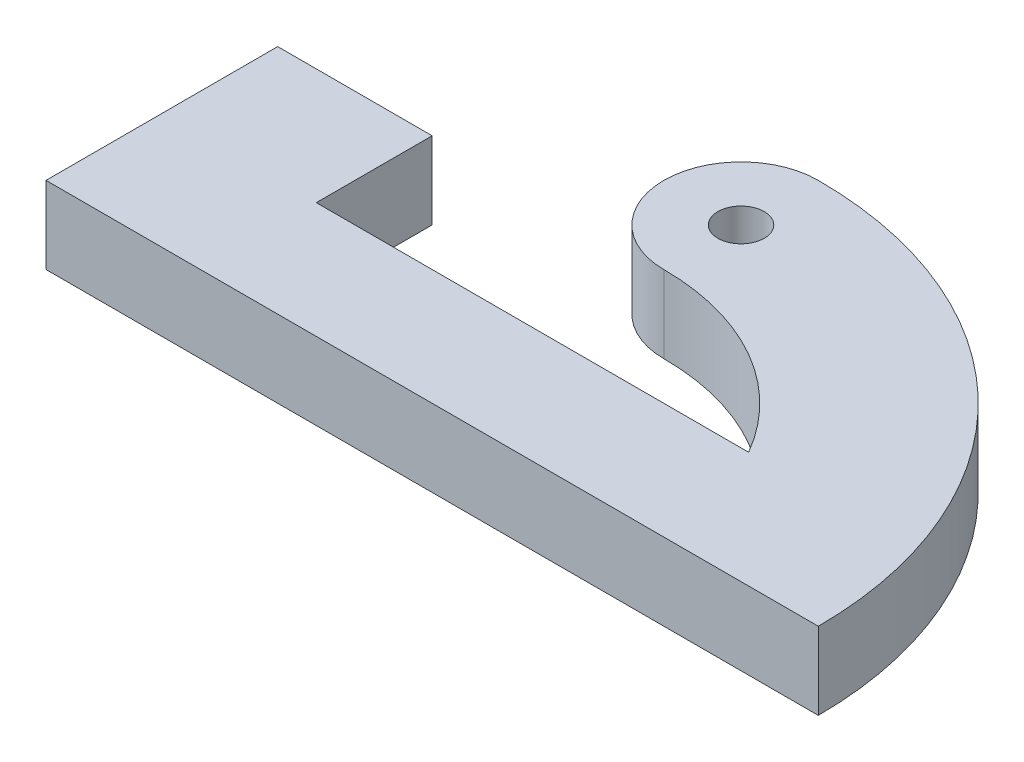
ISO-10303-21;
HEADER;
FILE_DESCRIPTION(('STEP AP214'),'2;1');
FILE_NAME('part.step','',(''),(''),'','','');
FILE_SCHEMA(('AUTOMOTIVE_DESIGN { 1 0 10303 214 1 1 1 1 }'));
ENDSEC;
DATA;
#1=APPLICATION_CONTEXT('core data for automotive mechanical design processes');
#2=APPLICATION_PROTOCOL_DEFINITION('international standard','automotive_design',2000,#1);
#3=PRODUCT_CONTEXT('',#1,'mechanical');
#4=PRODUCT('Part','Part','',(#3));
#5=PRODUCT_RELATED_PRODUCT_CATEGORY('part','',(#4));
#6=PRODUCT_DEFINITION_FORMATION('','',#4);
#7=PRODUCT_DEFINITION_CONTEXT('part definition',#1,'design');
#8=PRODUCT_DEFINITION('design','',#6,#7);
#9=PRODUCT_DEFINITION_SHAPE('','',#8);
#10=(LENGTH_UNIT() NAMED_UNIT(*) SI_UNIT(.MILLI.,.METRE.));
#11=(NAMED_UNIT(*) PLANE_ANGLE_UNIT() SI_UNIT($,.RADIAN.));
#12=(NAMED_UNIT(*) SI_UNIT($,.STERADIAN.) SOLID_ANGLE_UNIT());
#13=UNCERTAINTY_MEASURE_WITH_UNIT(LENGTH_MEASURE(1.E-05),#10,'distance_accuracy_value','');
#14=(GEOMETRIC_REPRESENTATION_CONTEXT(3) GLOBAL_UNCERTAINTY_ASSIGNED_CONTEXT((#13)) GLOBAL_UNIT_ASSIGNED_CONTEXT((#10,
#11,#12)) REPRESENTATION_CONTEXT('',''));
#15=CARTESIAN_POINT('',(0.,0.,0.));
#16=DIRECTION('',(0.,0.,1.));
#17=DIRECTION('',(1.,0.,0.));
#18=AXIS2_PLACEMENT_3D('',#15,#16,#17);
#19=CARTESIAN_POINT('',(0.,10.,0.));
#20=DIRECTION('',(0.,1.,0.));
#21=DIRECTION('',(0.,0.,1.));
#22=AXIS2_PLACEMENT_3D('',#19,#20,#21);
#23=PLANE('',#22);
#24=DIRECTION('',(1.,0.,0.));
#25=VECTOR('',#24,1.);
#26=CARTESIAN_POINT('',(0.,10.,0.));
#27=LINE('',#26,#25);
#28=CARTESIAN_POINT('',(-50.,10.,0.));
#29=VERTEX_POINT('',#28);
#30=CARTESIAN_POINT('',(50.,10.,0.));
#31=VERTEX_POINT('',#30);
#32=EDGE_CURVE('E63',#29,#31,#27,.T.);
#33=ORIENTED_EDGE('',*,*,#32,.T.);
#34=CARTESIAN_POINT('',(0.,10.,0.));
#35=DIRECTION('',(0.,1.,0.));
#36=DIRECTION('',(0.,0.,1.));
#37=AXIS2_PLACEMENT_3D('',#34,#35,#36);
#38=CIRCLE('',#37,50.);
#39=CARTESIAN_POINT('',(0.,10.,-50.));
#40=VERTEX_POINT('',#39);
#41=EDGE_CURVE('E107',#31,#40,#38,.T.);
#42=ORIENTED_EDGE('',*,*,#41,.T.);
#43=CARTESIAN_POINT('',(0.,10.,-40.));
#44=DIRECTION('',(0.,1.,0.));
#45=DIRECTION('',(0.,0.,1.));
#46=AXIS2_PLACEMENT_3D('',#43,#44,#45);
#47=CIRCLE('',#46,10.);
#48=CARTESIAN_POINT('',(0.,10.,-30.));
#49=VERTEX_POINT('',#48);
#50=EDGE_CURVE('E193',#40,#49,#47,.T.);
#51=ORIENTED_EDGE('',*,*,#50,.T.);
#52=CARTESIAN_POINT('',(0.,10.,0.));
#53=DIRECTION('',(0.,-1.,0.));
#54=DIRECTION('',(0.,0.,1.));
#55=AXIS2_PLACEMENT_3D('',#52,#53,#54);
#56=CIRCLE('',#55,30.);
#57=CARTESIAN_POINT('',(25.9807621135332,10.,-15.));
#58=VERTEX_POINT('',#57);
#59=EDGE_CURVE('E208',#49,#58,#56,.T.);
#60=ORIENTED_EDGE('',*,*,#59,.T.);
#61=DIRECTION('',(-1.,0.,0.));
#62=VECTOR('',#61,1.);
#63=CARTESIAN_POINT('',(-30.,10.,-15.));
#64=LINE('',#63,#62);
#65=CARTESIAN_POINT('',(-30.,10.,-15.));
#66=VERTEX_POINT('',#65);
#67=EDGE_CURVE('E127',#58,#66,#64,.T.);
#68=ORIENTED_EDGE('',*,*,#67,.T.);
#69=DIRECTION('',(0.,0.,-1.));
#70=VECTOR('',#69,1.);
#71=CARTESIAN_POINT('',(-30.,10.,-15.));
#72=LINE('',#71,#70);
#73=CARTESIAN_POINT('',(-30.,10.,-30.));
#74=VERTEX_POINT('',#73);
#75=EDGE_CURVE('E121',#66,#74,#72,.T.);
#76=ORIENTED_EDGE('',*,*,#75,.T.);
#77=DIRECTION('',(-1.,0.,0.));
#78=VECTOR('',#77,1.);
#79=CARTESIAN_POINT('',(-50.,10.,-30.));
#80=LINE('',#79,#78);
#81=CARTESIAN_POINT('',(-50.,10.,-30.));
#82=VERTEX_POINT('',#81);
#83=EDGE_CURVE('E125',#74,#82,#80,.T.);
#84=ORIENTED_EDGE('',*,*,#83,.T.);
#85=DIRECTION('',(0.,0.,1.));
#86=VECTOR('',#85,1.);
#87=CARTESIAN_POINT('',(-50.,10.,0.));
#88=LINE('',#87,#86);
#89=EDGE_CURVE('E144',#82,#29,#88,.T.);
#90=ORIENTED_EDGE('',*,*,#89,.T.);
#91=EDGE_LOOP('',(#33,#42,#51,#60,#68,#76,#84,#90));
#92=FACE_BOUND('',#91,.T.);
#93=CARTESIAN_POINT('',(0.,10.,-40.));
#94=DIRECTION('',(0.,1.,0.));
#95=DIRECTION('',(0.,0.,1.));
#96=AXIS2_PLACEMENT_3D('',#93,#94,#95);
#97=CIRCLE('',#96,3.);
#98=CARTESIAN_POINT('',(0.,10.,-37.));
#99=VERTEX_POINT('',#98);
#100=EDGE_CURVE('E155',#99,#99,#97,.T.);
#101=ORIENTED_EDGE('',*,*,#100,.F.);
#102=EDGE_LOOP('',(#101));
#103=FACE_BOUND('',#102,.T.);
#104=ADVANCED_FACE('F45',(#92,#103),#23,.T.);
#105=CARTESIAN_POINT('',(0.,0.,0.));
#106=DIRECTION('',(0.,1.,0.));
#107=DIRECTION('',(0.,0.,1.));
#108=AXIS2_PLACEMENT_3D('',#105,#106,#107);
#109=PLANE('',#108);
#110=CARTESIAN_POINT('',(0.,0.,0.));
#111=DIRECTION('',(0.,1.,0.));
#112=DIRECTION('',(0.,0.,1.));
#113=AXIS2_PLACEMENT_3D('',#110,#111,#112);
#114=CIRCLE('',#113,50.);
#115=CARTESIAN_POINT('',(50.,0.,0.));
#116=VERTEX_POINT('',#115);
#117=CARTESIAN_POINT('',(0.,0.,-50.));
#118=VERTEX_POINT('',#117);
#119=EDGE_CURVE('E151',#116,#118,#114,.T.);
#120=ORIENTED_EDGE('',*,*,#119,.F.);
#121=DIRECTION('',(1.,0.,0.));
#122=VECTOR('',#121,1.);
#123=CARTESIAN_POINT('',(-50.,0.,0.));
#124=LINE('',#123,#122);
#125=CARTESIAN_POINT('',(-50.,0.,0.));
#126=VERTEX_POINT('',#125);
#127=EDGE_CURVE('E170',#126,#116,#124,.T.);
#128=ORIENTED_EDGE('',*,*,#127,.F.);
#129=DIRECTION('',(0.,0.,1.));
#130=VECTOR('',#129,1.);
#131=CARTESIAN_POINT('',(-50.,0.,0.));
#132=LINE('',#131,#130);
#133=CARTESIAN_POINT('',(-50.,0.,-30.));
#134=VERTEX_POINT('',#133);
#135=EDGE_CURVE('E100',#134,#126,#132,.T.);
#136=ORIENTED_EDGE('',*,*,#135,.F.);
#137=DIRECTION('',(-1.,0.,0.));
#138=VECTOR('',#137,1.);
#139=CARTESIAN_POINT('',(-50.,0.,-30.));
#140=LINE('',#139,#138);
#141=CARTESIAN_POINT('',(-30.,0.,-30.));
#142=VERTEX_POINT('',#141);
#143=EDGE_CURVE('E93',#142,#134,#140,.T.);
#144=ORIENTED_EDGE('',*,*,#143,.F.);
#145=DIRECTION('',(0.,0.,-1.));
#146=VECTOR('',#145,1.);
#147=CARTESIAN_POINT('',(-30.,0.,-15.));
#148=LINE('',#147,#146);
#149=CARTESIAN_POINT('',(-30.,0.,-15.));
#150=VERTEX_POINT('',#149);
#151=EDGE_CURVE('E136',#150,#142,#148,.T.);
#152=ORIENTED_EDGE('',*,*,#151,.F.);
#153=DIRECTION('',(-1.,0.,0.));
#154=VECTOR('',#153,1.);
#155=CARTESIAN_POINT('',(-30.,0.,-15.));
#156=LINE('',#155,#154);
#157=CARTESIAN_POINT('',(25.9807621135332,0.,-15.));
#158=VERTEX_POINT('',#157);
#159=EDGE_CURVE('E161',#158,#150,#156,.T.);
#160=ORIENTED_EDGE('',*,*,#159,.F.);
#161=CARTESIAN_POINT('',(0.,0.,0.));
#162=DIRECTION('',(0.,-1.,0.));
#163=DIRECTION('',(0.,0.,1.));
#164=AXIS2_PLACEMENT_3D('',#161,#162,#163);
#165=CIRCLE('',#164,30.);
#166=CARTESIAN_POINT('',(0.,0.,-30.));
#167=VERTEX_POINT('',#166);
#168=EDGE_CURVE('E158',#167,#158,#165,.T.);
#169=ORIENTED_EDGE('',*,*,#168,.F.);
#170=CARTESIAN_POINT('',(0.,0.,-40.));
#171=DIRECTION('',(0.,1.,0.));
#172=DIRECTION('',(0.,0.,1.));
#173=AXIS2_PLACEMENT_3D('',#170,#171,#172);
#174=CIRCLE('',#173,10.);
#175=EDGE_CURVE('E154',#118,#167,#174,.T.);
#176=ORIENTED_EDGE('',*,*,#175,.F.);
#177=EDGE_LOOP('',(#120,#128,#136,#144,#152,#160,#169,#176));
#178=FACE_BOUND('',#177,.T.);
#179=CARTESIAN_POINT('',(0.,0.,-40.));
#180=DIRECTION('',(0.,1.,0.));
#181=DIRECTION('',(0.,0.,1.));
#182=AXIS2_PLACEMENT_3D('',#179,#180,#181);
#183=CIRCLE('',#182,3.);
#184=CARTESIAN_POINT('',(0.,0.,-37.));
#185=VERTEX_POINT('',#184);
#186=EDGE_CURVE('E218',#185,#185,#183,.T.);
#187=ORIENTED_EDGE('',*,*,#186,.T.);
#188=EDGE_LOOP('',(#187));
#189=FACE_BOUND('',#188,.T.);
#190=ADVANCED_FACE('F197',(#178,#189),#109,.F.);
#191=CARTESIAN_POINT('',(0.,10.,0.));
#192=DIRECTION('',(0.,-1.,0.));
#193=DIRECTION('',(0.,0.,-1.));
#194=AXIS2_PLACEMENT_3D('',#191,#192,#193);
#195=CYLINDRICAL_SURFACE('',#194,50.);
#196=ORIENTED_EDGE('',*,*,#119,.T.);
#197=DIRECTION('',(0.,-1.,0.));
#198=VECTOR('',#197,1.);
#199=CARTESIAN_POINT('',(0.,10.,-50.));
#200=LINE('',#199,#198);
#201=EDGE_CURVE('E55',#40,#118,#200,.T.);
#202=ORIENTED_EDGE('',*,*,#201,.F.);
#203=ORIENTED_EDGE('',*,*,#41,.F.);
#204=DIRECTION('',(0.,-1.,0.));
#205=VECTOR('',#204,1.);
#206=CARTESIAN_POINT('',(50.,10.,0.));
#207=LINE('',#206,#205);
#208=EDGE_CURVE('E11',#31,#116,#207,.T.);
#209=ORIENTED_EDGE('',*,*,#208,.T.);
#210=EDGE_LOOP('',(#196,#202,#203,#209));
#211=FACE_BOUND('',#210,.T.);
#212=ADVANCED_FACE('F47',(#211),#195,.T.);
#213=CARTESIAN_POINT('',(0.,10.,-40.));
#214=DIRECTION('',(0.,-1.,0.));
#215=DIRECTION('',(0.,0.,-1.));
#216=AXIS2_PLACEMENT_3D('',#213,#214,#215);
#217=CYLINDRICAL_SURFACE('',#216,10.);
#218=ORIENTED_EDGE('',*,*,#175,.T.);
#219=DIRECTION('',(0.,-1.,0.));
#220=VECTOR('',#219,1.);
#221=CARTESIAN_POINT('',(0.,10.,-30.));
#222=LINE('',#221,#220);
#223=EDGE_CURVE('E183',#49,#167,#222,.T.);
#224=ORIENTED_EDGE('',*,*,#223,.F.);
#225=ORIENTED_EDGE('',*,*,#50,.F.);
#226=ORIENTED_EDGE('',*,*,#201,.T.);
#227=EDGE_LOOP('',(#218,#224,#225,#226));
#228=FACE_BOUND('',#227,.T.);
#229=ADVANCED_FACE('F191',(#228),#217,.T.);
#230=CARTESIAN_POINT('',(0.,10.,0.));
#231=DIRECTION('',(0.,-1.,0.));
#232=DIRECTION('',(0.,0.,-1.));
#233=AXIS2_PLACEMENT_3D('',#230,#231,#232);
#234=CYLINDRICAL_SURFACE('',#233,30.);
#235=ORIENTED_EDGE('',*,*,#168,.T.);
#236=DIRECTION('',(0.,-1.,0.));
#237=VECTOR('',#236,1.);
#238=CARTESIAN_POINT('',(25.9807621135332,10.,-15.));
#239=LINE('',#238,#237);
#240=EDGE_CURVE('E179',#58,#158,#239,.T.);
#241=ORIENTED_EDGE('',*,*,#240,.F.);
#242=ORIENTED_EDGE('',*,*,#59,.F.);
#243=ORIENTED_EDGE('',*,*,#223,.T.);
#244=EDGE_LOOP('',(#235,#241,#242,#243));
#245=FACE_BOUND('',#244,.T.);
#246=ADVANCED_FACE('F203',(#245),#234,.F.);
#247=CARTESIAN_POINT('',(-30.,10.,-15.));
#248=DIRECTION('',(0.,0.,1.));
#249=DIRECTION('',(1.,0.,0.));
#250=AXIS2_PLACEMENT_3D('',#247,#248,#249);
#251=PLANE('',#250);
#252=ORIENTED_EDGE('',*,*,#159,.T.);
#253=DIRECTION('',(0.,-1.,0.));
#254=VECTOR('',#253,1.);
#255=CARTESIAN_POINT('',(-30.,10.,-15.));
#256=LINE('',#255,#254);
#257=EDGE_CURVE('E138',#66,#150,#256,.T.);
#258=ORIENTED_EDGE('',*,*,#257,.F.);
#259=ORIENTED_EDGE('',*,*,#67,.F.);
#260=ORIENTED_EDGE('',*,*,#240,.T.);
#261=EDGE_LOOP('',(#252,#258,#259,#260));
#262=FACE_BOUND('',#261,.T.);
#263=ADVANCED_FACE('F206',(#262),#251,.F.);
#264=CARTESIAN_POINT('',(-30.,10.,-15.));
#265=DIRECTION('',(-1.,0.,0.));
#266=DIRECTION('',(0.,0.,1.));
#267=AXIS2_PLACEMENT_3D('',#264,#265,#266);
#268=PLANE('',#267);
#269=ORIENTED_EDGE('',*,*,#151,.T.);
#270=DIRECTION('',(0.,-1.,0.));
#271=VECTOR('',#270,1.);
#272=CARTESIAN_POINT('',(-30.,10.,-30.));
#273=LINE('',#272,#271);
#274=EDGE_CURVE('E133',#74,#142,#273,.T.);
#275=ORIENTED_EDGE('',*,*,#274,.F.);
#276=ORIENTED_EDGE('',*,*,#75,.F.);
#277=ORIENTED_EDGE('',*,*,#257,.T.);
#278=EDGE_LOOP('',(#269,#275,#276,#277));
#279=FACE_BOUND('',#278,.T.);
#280=ADVANCED_FACE('F134',(#279),#268,.F.);
#281=CARTESIAN_POINT('',(-50.,10.,-30.));
#282=DIRECTION('',(0.,0.,1.));
#283=DIRECTION('',(1.,0.,0.));
#284=AXIS2_PLACEMENT_3D('',#281,#282,#283);
#285=PLANE('',#284);
#286=ORIENTED_EDGE('',*,*,#143,.T.);
#287=DIRECTION('',(0.,-1.,0.));
#288=VECTOR('',#287,1.);
#289=CARTESIAN_POINT('',(-50.,10.,-30.));
#290=LINE('',#289,#288);
#291=EDGE_CURVE('E139',#82,#134,#290,.T.);
#292=ORIENTED_EDGE('',*,*,#291,.F.);
#293=ORIENTED_EDGE('',*,*,#83,.F.);
#294=ORIENTED_EDGE('',*,*,#274,.T.);
#295=EDGE_LOOP('',(#286,#292,#293,#294));
#296=FACE_BOUND('',#295,.T.);
#297=ADVANCED_FACE('F141',(#296),#285,.F.);
#298=CARTESIAN_POINT('',(-50.,10.,0.));
#299=DIRECTION('',(1.,0.,0.));
#300=DIRECTION('',(0.,0.,-1.));
#301=AXIS2_PLACEMENT_3D('',#298,#299,#300);
#302=PLANE('',#301);
#303=ORIENTED_EDGE('',*,*,#135,.T.);
#304=DIRECTION('',(0.,-1.,0.));
#305=VECTOR('',#304,1.);
#306=CARTESIAN_POINT('',(-50.,10.,0.));
#307=LINE('',#306,#305);
#308=EDGE_CURVE('E147',#29,#126,#307,.T.);
#309=ORIENTED_EDGE('',*,*,#308,.F.);
#310=ORIENTED_EDGE('',*,*,#89,.F.);
#311=ORIENTED_EDGE('',*,*,#291,.T.);
#312=EDGE_LOOP('',(#303,#309,#310,#311));
#313=FACE_BOUND('',#312,.T.);
#314=ADVANCED_FACE('F239',(#313),#302,.F.);
#315=CARTESIAN_POINT('',(-50.,10.,0.));
#316=DIRECTION('',(0.,0.,-1.));
#317=DIRECTION('',(-1.,0.,0.));
#318=AXIS2_PLACEMENT_3D('',#315,#316,#317);
#319=PLANE('',#318);
#320=ORIENTED_EDGE('',*,*,#127,.T.);
#321=ORIENTED_EDGE('',*,*,#208,.F.);
#322=ORIENTED_EDGE('',*,*,#32,.F.);
#323=ORIENTED_EDGE('',*,*,#308,.T.);
#324=EDGE_LOOP('',(#320,#321,#322,#323));
#325=FACE_BOUND('',#324,.T.);
#326=ADVANCED_FACE('F236',(#325),#319,.F.);
#327=CARTESIAN_POINT('',(0.,10.,-40.));
#328=DIRECTION('',(0.,-1.,0.));
#329=DIRECTION('',(0.,0.,-1.));
#330=AXIS2_PLACEMENT_3D('',#327,#328,#329);
#331=CYLINDRICAL_SURFACE('',#330,3.);
#332=ORIENTED_EDGE('',*,*,#100,.T.);
#333=EDGE_LOOP('',(#332));
#334=FACE_BOUND('',#333,.T.);
#335=ORIENTED_EDGE('',*,*,#186,.F.);
#336=EDGE_LOOP('',(#335));
#337=FACE_BOUND('',#336,.T.);
#338=ADVANCED_FACE('F226',(#334,#337),#331,.F.);
#339=CLOSED_SHELL('',(#104,#190,#212,#229,#246,#263,#280,#297,#314,#326,#338));
#340=MANIFOLD_SOLID_BREP('B2',#339);
#341=ADVANCED_BREP_SHAPE_REPRESENTATION('',(#18,#340),#14);
#342=SHAPE_DEFINITION_REPRESENTATION(#9,#341);
ENDSEC;
END-ISO-10303-21;
